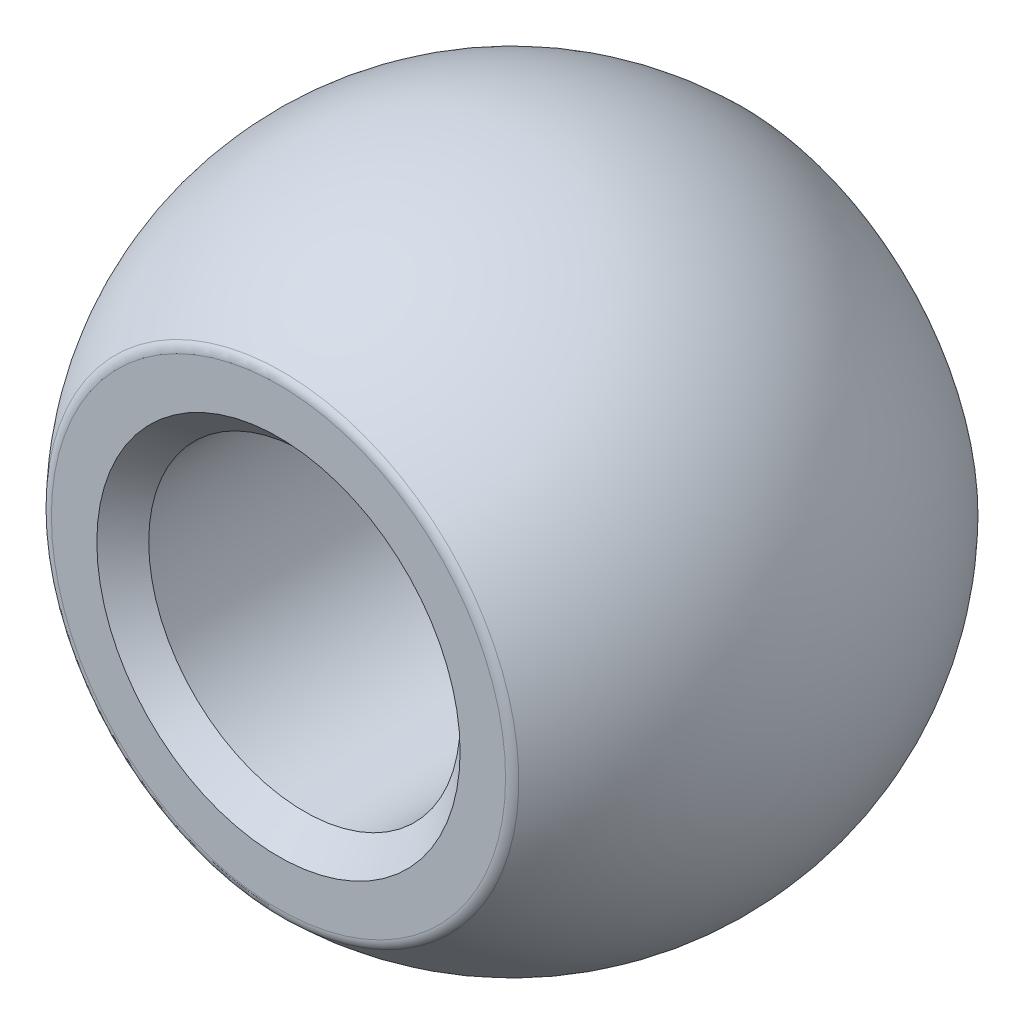
ISO-10303-21;
HEADER;
FILE_DESCRIPTION(('STEP AP214'),'2;1');
FILE_NAME('part.step','',(''),(''),'','','');
FILE_SCHEMA(('AUTOMOTIVE_DESIGN { 1 0 10303 214 1 1 1 1 }'));
ENDSEC;
DATA;
#1=APPLICATION_CONTEXT('core data for automotive mechanical design processes');
#2=APPLICATION_PROTOCOL_DEFINITION('international standard','automotive_design',2000,#1);
#3=PRODUCT_CONTEXT('',#1,'mechanical');
#4=PRODUCT('Part','Part','',(#3));
#5=PRODUCT_RELATED_PRODUCT_CATEGORY('part','',(#4));
#6=PRODUCT_DEFINITION_FORMATION('','',#4);
#7=PRODUCT_DEFINITION_CONTEXT('part definition',#1,'design');
#8=PRODUCT_DEFINITION('design','',#6,#7);
#9=PRODUCT_DEFINITION_SHAPE('','',#8);
#10=(LENGTH_UNIT() NAMED_UNIT(*) SI_UNIT(.MILLI.,.METRE.));
#11=(NAMED_UNIT(*) PLANE_ANGLE_UNIT() SI_UNIT($,.RADIAN.));
#12=(NAMED_UNIT(*) SI_UNIT($,.STERADIAN.) SOLID_ANGLE_UNIT());
#13=UNCERTAINTY_MEASURE_WITH_UNIT(LENGTH_MEASURE(1.E-05),#10,'distance_accuracy_value','');
#14=(GEOMETRIC_REPRESENTATION_CONTEXT(3) GLOBAL_UNCERTAINTY_ASSIGNED_CONTEXT((#13)) GLOBAL_UNIT_ASSIGNED_CONTEXT((#10,
#11,#12)) REPRESENTATION_CONTEXT('',''));
#15=CARTESIAN_POINT('',(0.,0.,0.));
#16=DIRECTION('',(0.,0.,1.));
#17=DIRECTION('',(1.,0.,0.));
#18=AXIS2_PLACEMENT_3D('',#15,#16,#17);
#19=CARTESIAN_POINT('',(0.,0.,-6.35));
#20=DIRECTION('',(0.,0.,1.));
#21=DIRECTION('',(1.,0.,0.));
#22=AXIS2_PLACEMENT_3D('',#19,#20,#21);
#23=CYLINDRICAL_SURFACE('',#22,3.);
#24=CARTESIAN_POINT('',(0.,0.,4.));
#25=DIRECTION('',(0.,0.,-1.));
#26=DIRECTION('',(-1.,0.,0.));
#27=AXIS2_PLACEMENT_3D('',#24,#25,#26);
#28=CIRCLE('',#27,3.);
#29=CARTESIAN_POINT('',(-3.,0.,4.));
#30=VERTEX_POINT('',#29);
#31=EDGE_CURVE('E52',#30,#30,#28,.F.);
#32=ORIENTED_EDGE('',*,*,#31,.T.);
#33=EDGE_LOOP('',(#32));
#34=FACE_BOUND('',#33,.T.);
#35=CARTESIAN_POINT('',(0.,0.,-4.));
#36=DIRECTION('',(0.,0.,1.));
#37=DIRECTION('',(1.,0.,0.));
#38=AXIS2_PLACEMENT_3D('',#35,#36,#37);
#39=CIRCLE('',#38,3.);
#40=CARTESIAN_POINT('',(3.,0.,-4.));
#41=VERTEX_POINT('',#40);
#42=EDGE_CURVE('E60',#41,#41,#39,.F.);
#43=ORIENTED_EDGE('',*,*,#42,.T.);
#44=EDGE_LOOP('',(#43));
#45=FACE_BOUND('',#44,.T.);
#46=ADVANCED_FACE('F41',(#34,#45),#23,.F.);
#47=CARTESIAN_POINT('',(-6.35,-6.35,-4.5));
#48=DIRECTION('',(0.,0.,1.));
#49=DIRECTION('',(1.,0.,0.));
#50=AXIS2_PLACEMENT_3D('',#47,#48,#49);
#51=PLANE('',#50);
#52=CARTESIAN_POINT('',(0.,0.,-4.5));
#53=DIRECTION('',(0.,0.,1.));
#54=DIRECTION('',(1.,0.,0.));
#55=AXIS2_PLACEMENT_3D('',#52,#53,#54);
#56=CIRCLE('',#55,3.50000000000001);
#57=CARTESIAN_POINT('',(3.50000000000001,0.,-4.5));
#58=VERTEX_POINT('',#57);
#59=EDGE_CURVE('E10',#58,#58,#56,.T.);
#60=ORIENTED_EDGE('',*,*,#59,.T.);
#61=EDGE_LOOP('',(#60));
#62=FACE_BOUND('',#61,.T.);
#63=CARTESIAN_POINT('',(0.,0.,-4.5));
#64=DIRECTION('',(0.,0.,1.));
#65=DIRECTION('',(1.,0.,0.));
#66=AXIS2_PLACEMENT_3D('',#63,#64,#65);
#67=CIRCLE('',#66,4.37578564374445);
#68=CARTESIAN_POINT('',(4.37578564374445,0.,-4.5));
#69=VERTEX_POINT('',#68);
#70=EDGE_CURVE('E64',#69,#69,#67,.F.);
#71=ORIENTED_EDGE('',*,*,#70,.T.);
#72=EDGE_LOOP('',(#71));
#73=FACE_BOUND('',#72,.T.);
#74=ADVANCED_FACE('F94',(#62,#73),#51,.F.);
#75=CARTESIAN_POINT('',(-6.35,-6.35,4.5));
#76=DIRECTION('',(0.,0.,-1.));
#77=DIRECTION('',(-1.,0.,0.));
#78=AXIS2_PLACEMENT_3D('',#75,#76,#77);
#79=PLANE('',#78);
#80=CARTESIAN_POINT('',(0.,0.,4.5));
#81=DIRECTION('',(0.,0.,-1.));
#82=DIRECTION('',(-1.,0.,0.));
#83=AXIS2_PLACEMENT_3D('',#80,#81,#82);
#84=CIRCLE('',#83,3.5);
#85=CARTESIAN_POINT('',(-3.5,0.,4.5));
#86=VERTEX_POINT('',#85);
#87=EDGE_CURVE('E47',#86,#86,#84,.T.);
#88=ORIENTED_EDGE('',*,*,#87,.T.);
#89=EDGE_LOOP('',(#88));
#90=FACE_BOUND('',#89,.T.);
#91=CARTESIAN_POINT('',(0.,0.,4.5));
#92=DIRECTION('',(0.,0.,-1.));
#93=DIRECTION('',(-1.,0.,0.));
#94=AXIS2_PLACEMENT_3D('',#91,#92,#93);
#95=CIRCLE('',#94,4.37578564374445);
#96=CARTESIAN_POINT('',(-4.37578564374445,0.,4.5));
#97=VERTEX_POINT('',#96);
#98=EDGE_CURVE('E72',#97,#97,#95,.F.);
#99=ORIENTED_EDGE('',*,*,#98,.T.);
#100=EDGE_LOOP('',(#99));
#101=FACE_BOUND('',#100,.T.);
#102=ADVANCED_FACE('F73',(#90,#101),#79,.F.);
#103=CARTESIAN_POINT('',(0.,0.,0.));
#104=DIRECTION('',(0.,1.,0.));
#105=DIRECTION('',(1.,0.,0.));
#106=AXIS2_PLACEMENT_3D('',#103,#104,#105);
#107=SPHERICAL_SURFACE('',#106,6.35);
#108=CARTESIAN_POINT('',(0.,0.,0.));
#109=DIRECTION('',(0.,0.,-1.));
#110=DIRECTION('',(-1.,0.,0.));
#111=AXIS2_PLACEMENT_3D('',#108,#109,#110);
#112=SPHERICAL_SURFACE('',#111,6.35);
#113=CARTESIAN_POINT('',(0.,0.,4.42418032786885));
#114=DIRECTION('',(0.,0.,-1.));
#115=DIRECTION('',(-1.,0.,0.));
#116=AXIS2_PLACEMENT_3D('',#113,#114,#115);
#117=CIRCLE('',#116,4.55512112094709);
#118=CARTESIAN_POINT('',(-4.55512112094709,0.,4.42418032786885));
#119=VERTEX_POINT('',#118);
#120=EDGE_CURVE('E61',#119,#119,#117,.T.);
#121=ORIENTED_EDGE('',*,*,#120,.T.);
#122=EDGE_LOOP('',(#121));
#123=FACE_BOUND('',#122,.T.);
#124=CARTESIAN_POINT('',(0.,0.,-4.42418032786885));
#125=DIRECTION('',(0.,0.,1.));
#126=DIRECTION('',(1.,0.,0.));
#127=AXIS2_PLACEMENT_3D('',#124,#125,#126);
#128=CIRCLE('',#127,4.55512112094709);
#129=CARTESIAN_POINT('',(4.55512112094709,0.,-4.42418032786885));
#130=VERTEX_POINT('',#129);
#131=EDGE_CURVE('E70',#130,#130,#128,.T.);
#132=ORIENTED_EDGE('',*,*,#131,.T.);
#133=EDGE_LOOP('',(#132));
#134=FACE_BOUND('',#133,.T.);
#135=ADVANCED_FACE('F76',(#123,#134),#112,.T.);
#136=CARTESIAN_POINT('',(0.,0.,4.25));
#137=DIRECTION('',(0.,0.,-1.));
#138=DIRECTION('',(-1.,0.,0.));
#139=AXIS2_PLACEMENT_3D('',#136,#137,#138);
#140=TOROIDAL_SURFACE('',#139,4.37578564374445,0.25);
#141=ORIENTED_EDGE('',*,*,#120,.F.);
#142=EDGE_LOOP('',(#141));
#143=FACE_BOUND('',#142,.T.);
#144=ORIENTED_EDGE('',*,*,#98,.F.);
#145=EDGE_LOOP('',(#144));
#146=FACE_BOUND('',#145,.T.);
#147=ADVANCED_FACE('F79',(#143,#146),#140,.T.);
#148=CARTESIAN_POINT('',(0.,0.,-4.25));
#149=DIRECTION('',(0.,0.,1.));
#150=DIRECTION('',(1.,0.,0.));
#151=AXIS2_PLACEMENT_3D('',#148,#149,#150);
#152=TOROIDAL_SURFACE('',#151,4.37578564374445,0.25);
#153=ORIENTED_EDGE('',*,*,#131,.F.);
#154=EDGE_LOOP('',(#153));
#155=FACE_BOUND('',#154,.T.);
#156=ORIENTED_EDGE('',*,*,#70,.F.);
#157=EDGE_LOOP('',(#156));
#158=FACE_BOUND('',#157,.T.);
#159=ADVANCED_FACE('F80',(#155,#158),#152,.T.);
#160=CARTESIAN_POINT('',(0.,0.,4.));
#161=DIRECTION('',(0.,0.,1.));
#162=DIRECTION('',(1.,0.,0.));
#163=AXIS2_PLACEMENT_3D('',#160,#161,#162);
#164=CONICAL_SURFACE('',#163,3.,0.785398163397449);
#165=ORIENTED_EDGE('',*,*,#87,.F.);
#166=EDGE_LOOP('',(#165));
#167=FACE_BOUND('',#166,.T.);
#168=ORIENTED_EDGE('',*,*,#31,.F.);
#169=EDGE_LOOP('',(#168));
#170=FACE_BOUND('',#169,.T.);
#171=ADVANCED_FACE('F87',(#167,#170),#164,.F.);
#172=CARTESIAN_POINT('',(0.,0.,-4.));
#173=DIRECTION('',(0.,0.,-1.));
#174=DIRECTION('',(-1.,0.,0.));
#175=AXIS2_PLACEMENT_3D('',#172,#173,#174);
#176=CONICAL_SURFACE('',#175,3.,0.785398163397452);
#177=ORIENTED_EDGE('',*,*,#59,.F.);
#178=EDGE_LOOP('',(#177));
#179=FACE_BOUND('',#178,.T.);
#180=ORIENTED_EDGE('',*,*,#42,.F.);
#181=EDGE_LOOP('',(#180));
#182=FACE_BOUND('',#181,.T.);
#183=ADVANCED_FACE('F42',(#179,#182),#176,.F.);
#184=CLOSED_SHELL('',(#46,#74,#102,#135,#147,#159,#171,#183));
#185=MANIFOLD_SOLID_BREP('B2',#184);
#186=ADVANCED_BREP_SHAPE_REPRESENTATION('',(#18,#185),#14);
#187=SHAPE_DEFINITION_REPRESENTATION(#9,#186);
ENDSEC;
END-ISO-10303-21;
